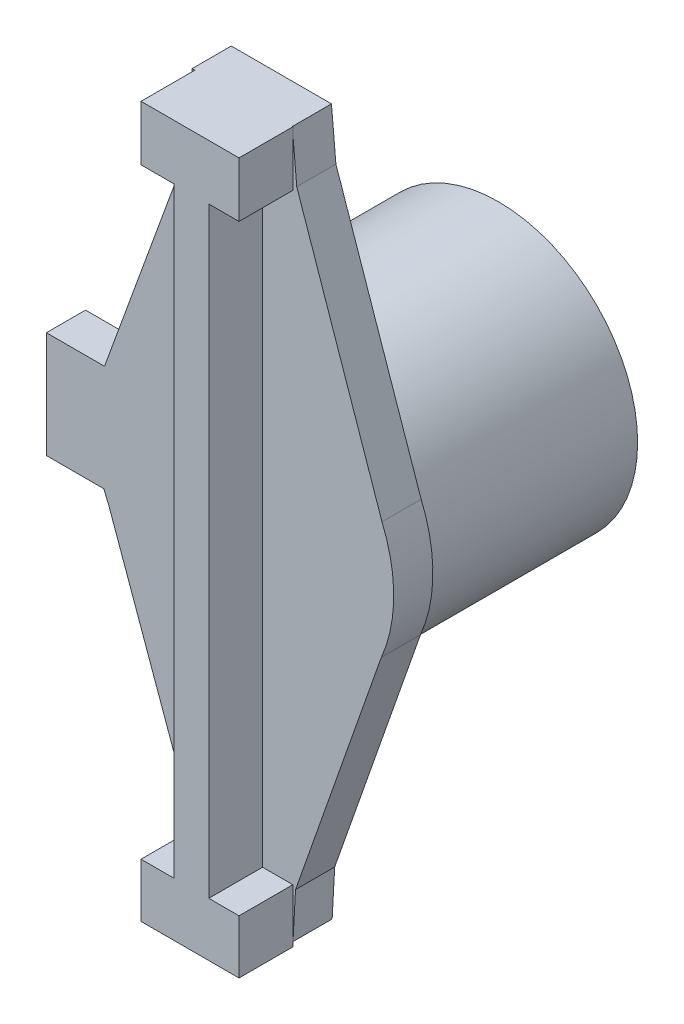
ISO-10303-21;
HEADER;
FILE_DESCRIPTION(('STEP AP214'),'2;1');
FILE_NAME('part.step','',(''),(''),'','','');
FILE_SCHEMA(('AUTOMOTIVE_DESIGN { 1 0 10303 214 1 1 1 1 }'));
ENDSEC;
DATA;
#1=APPLICATION_CONTEXT('core data for automotive mechanical design processes');
#2=APPLICATION_PROTOCOL_DEFINITION('international standard','automotive_design',2000,#1);
#3=PRODUCT_CONTEXT('',#1,'mechanical');
#4=PRODUCT('Part','Part','',(#3));
#5=PRODUCT_RELATED_PRODUCT_CATEGORY('part','',(#4));
#6=PRODUCT_DEFINITION_FORMATION('','',#4);
#7=PRODUCT_DEFINITION_CONTEXT('part definition',#1,'design');
#8=PRODUCT_DEFINITION('design','',#6,#7);
#9=PRODUCT_DEFINITION_SHAPE('','',#8);
#10=(LENGTH_UNIT() NAMED_UNIT(*) SI_UNIT(.MILLI.,.METRE.));
#11=(NAMED_UNIT(*) PLANE_ANGLE_UNIT() SI_UNIT($,.RADIAN.));
#12=(NAMED_UNIT(*) SI_UNIT($,.STERADIAN.) SOLID_ANGLE_UNIT());
#13=UNCERTAINTY_MEASURE_WITH_UNIT(LENGTH_MEASURE(1.E-05),#10,'distance_accuracy_value','');
#14=(GEOMETRIC_REPRESENTATION_CONTEXT(3) GLOBAL_UNCERTAINTY_ASSIGNED_CONTEXT((#13)) GLOBAL_UNIT_ASSIGNED_CONTEXT((#10,
#11,#12)) REPRESENTATION_CONTEXT('',''));
#15=CARTESIAN_POINT('',(0.,0.,0.));
#16=DIRECTION('',(0.,0.,1.));
#17=DIRECTION('',(1.,0.,0.));
#18=AXIS2_PLACEMENT_3D('',#15,#16,#17);
#19=CARTESIAN_POINT('',(0.,0.,0.052));
#20=DIRECTION('',(0.,0.,1.));
#21=DIRECTION('',(1.,0.,0.));
#22=AXIS2_PLACEMENT_3D('',#19,#20,#21);
#23=PLANE('',#22);
#24=DIRECTION('',(-1.,0.,0.));
#25=VECTOR('',#24,1.);
#26=CARTESIAN_POINT('',(-0.0100488610567288,-0.0614435844659321,0.052));
#27=LINE('',#26,#25);
#28=CARTESIAN_POINT('',(-0.00327120184824655,-0.0614435844659321,0.052));
#29=VERTEX_POINT('',#28);
#30=CARTESIAN_POINT('',(-0.0100488610567288,-0.0614435844659321,0.052));
#31=VERTEX_POINT('',#30);
#32=EDGE_CURVE('E272',#29,#31,#27,.T.);
#33=ORIENTED_EDGE('',*,*,#32,.F.);
#34=DIRECTION('',(0.,-1.,0.));
#35=VECTOR('',#34,1.);
#36=CARTESIAN_POINT('',(-0.00327120184824655,-0.0614435844659321,0.052));
#37=LINE('',#36,#35);
#38=CARTESIAN_POINT('',(-0.00327120184824655,0.0614105010447875,0.052));
#39=VERTEX_POINT('',#38);
#40=EDGE_CURVE('E247',#39,#29,#37,.T.);
#41=ORIENTED_EDGE('',*,*,#40,.F.);
#42=DIRECTION('',(1.,0.,0.));
#43=VECTOR('',#42,1.);
#44=CARTESIAN_POINT('',(-0.0100488610567288,0.0614105010447875,0.052));
#45=LINE('',#44,#43);
#46=CARTESIAN_POINT('',(-0.0100488610567288,0.0614105010447875,0.052));
#47=VERTEX_POINT('',#46);
#48=EDGE_CURVE('E65',#47,#39,#45,.T.);
#49=ORIENTED_EDGE('',*,*,#48,.F.);
#50=DIRECTION('',(0.,-1.,0.));
#51=VECTOR('',#50,1.);
#52=CARTESIAN_POINT('',(-0.0100488610567288,0.0726560830045513,0.052));
#53=LINE('',#52,#51);
#54=CARTESIAN_POINT('',(-0.0100488610567288,0.0726560830045513,0.052));
#55=VERTEX_POINT('',#54);
#56=EDGE_CURVE('E536',#55,#47,#53,.T.);
#57=ORIENTED_EDGE('',*,*,#56,.F.);
#58=DIRECTION('',(-1.,0.,0.));
#59=VECTOR('',#58,1.);
#60=CARTESIAN_POINT('',(-0.0106172179803252,0.0726560830045513,0.052));
#61=LINE('',#60,#59);
#62=CARTESIAN_POINT('',(-0.0106172179803252,0.0726560830045513,0.052));
#63=VERTEX_POINT('',#62);
#64=EDGE_CURVE('E273',#55,#63,#61,.T.);
#65=ORIENTED_EDGE('',*,*,#64,.T.);
#66=DIRECTION('',(0.,-1.,0.));
#67=VECTOR('',#66,1.);
#68=CARTESIAN_POINT('',(-0.0106172179803252,0.0601865723729134,0.052));
#69=LINE('',#68,#67);
#70=CARTESIAN_POINT('',(-0.0106172179803252,0.0601865723729134,0.052));
#71=VERTEX_POINT('',#70);
#72=EDGE_CURVE('E275',#63,#71,#69,.T.);
#73=ORIENTED_EDGE('',*,*,#72,.T.);
#74=DIRECTION('',(-0.342138082617705,-0.939649686012123,0.));
#75=VECTOR('',#74,1.);
#76=CARTESIAN_POINT('',(-0.0285118584912178,0.0110406450656972,0.052));
#77=LINE('',#76,#75);
#78=CARTESIAN_POINT('',(-0.0285118584912178,0.0110406450656972,0.052));
#79=VERTEX_POINT('',#78);
#80=EDGE_CURVE('E278',#71,#79,#77,.T.);
#81=ORIENTED_EDGE('',*,*,#80,.T.);
#82=DIRECTION('',(-1.,0.,0.));
#83=VECTOR('',#82,1.);
#84=CARTESIAN_POINT('',(-0.0285118584912178,0.0110406450656972,0.052));
#85=LINE('',#84,#83);
#86=CARTESIAN_POINT('',(-0.0403866580337496,0.0110406450656972,0.052));
#87=VERTEX_POINT('',#86);
#88=EDGE_CURVE('E280',#79,#87,#85,.T.);
#89=ORIENTED_EDGE('',*,*,#88,.T.);
#90=DIRECTION('',(0.,-1.,0.));
#91=VECTOR('',#90,1.);
#92=CARTESIAN_POINT('',(-0.0403866580337496,0.0110406450656972,0.052));
#93=LINE('',#92,#91);
#94=CARTESIAN_POINT('',(-0.0403866580337496,-0.0106909975956442,0.052));
#95=VERTEX_POINT('',#94);
#96=EDGE_CURVE('E282',#87,#95,#93,.T.);
#97=ORIENTED_EDGE('',*,*,#96,.T.);
#98=DIRECTION('',(1.,0.,0.));
#99=VECTOR('',#98,1.);
#100=CARTESIAN_POINT('',(-0.0286447986290681,-0.0106909975956442,0.052));
#101=LINE('',#100,#99);
#102=CARTESIAN_POINT('',(-0.0286447986290681,-0.0106909975956442,0.052));
#103=VERTEX_POINT('',#102);
#104=EDGE_CURVE('E284',#95,#103,#101,.T.);
#105=ORIENTED_EDGE('',*,*,#104,.T.);
#106=CARTESIAN_POINT('',(0.,0.,0.052));
#107=DIRECTION('',(0.,0.,1.));
#108=DIRECTION('',(1.,0.,0.));
#109=AXIS2_PLACEMENT_3D('',#106,#107,#108);
#110=CIRCLE('',#109,0.0305748576135676);
#111=CARTESIAN_POINT('',(-0.0277124755475539,-0.0129166798023393,0.052));
#112=VERTEX_POINT('',#111);
#113=EDGE_CURVE('E286',#103,#112,#110,.T.);
#114=ORIENTED_EDGE('',*,*,#113,.T.);
#115=DIRECTION('',(0.338022111685065,-0.941138168396102,0.));
#116=VECTOR('',#115,1.);
#117=CARTESIAN_POINT('',(-0.0277124755475539,-0.0129166798023393,0.052));
#118=LINE('',#117,#116);
#119=CARTESIAN_POINT('',(-0.0112383142113686,-0.058784868568182,0.052));
#120=VERTEX_POINT('',#119);
#121=EDGE_CURVE('E288',#112,#120,#118,.T.);
#122=ORIENTED_EDGE('',*,*,#121,.T.);
#123=DIRECTION('',(0.0969304244465507,-0.995291159820387,0.));
#124=VECTOR('',#123,1.);
#125=CARTESIAN_POINT('',(-0.0112383142113686,-0.058784868568182,0.052));
#126=LINE('',#125,#124);
#127=CARTESIAN_POINT('',(-0.0100488610567288,-0.0709982908924209,0.052));
#128=VERTEX_POINT('',#127);
#129=EDGE_CURVE('E291',#120,#128,#126,.T.);
#130=ORIENTED_EDGE('',*,*,#129,.T.);
#131=DIRECTION('',(0.,-1.,0.));
#132=VECTOR('',#131,1.);
#133=CARTESIAN_POINT('',(-0.0100488610567288,-0.0724526365547243,0.052));
#134=LINE('',#133,#132);
#135=EDGE_CURVE('E265',#31,#128,#134,.T.);
#136=ORIENTED_EDGE('',*,*,#135,.F.);
#137=EDGE_LOOP('',(#33,#41,#49,#57,#65,#73,#81,#89,#97,#105,#114,#122,#130,#136));
#138=FACE_BOUND('',#137,.T.);
#139=ADVANCED_FACE('F39',(#138),#23,.T.);
#140=CARTESIAN_POINT('',(0.00378832617781402,0.0614105010447875,0.052));
#141=VERTEX_POINT('',#140);
#142=CARTESIAN_POINT('',(0.0099699094616387,0.0614105010447875,0.052));
#143=VERTEX_POINT('',#142);
#144=EDGE_CURVE('E538',#141,#143,#45,.T.);
#145=ORIENTED_EDGE('',*,*,#144,.F.);
#146=DIRECTION('',(0.,1.,0.));
#147=VECTOR('',#146,1.);
#148=CARTESIAN_POINT('',(0.00378832617781402,-0.0614435844659321,0.052));
#149=LINE('',#148,#147);
#150=CARTESIAN_POINT('',(0.00378832617781402,-0.0614435844659321,0.052));
#151=VERTEX_POINT('',#150);
#152=EDGE_CURVE('E242',#151,#141,#149,.T.);
#153=ORIENTED_EDGE('',*,*,#152,.F.);
#154=CARTESIAN_POINT('',(0.0099699094616387,-0.0614435844659321,0.052));
#155=VERTEX_POINT('',#154);
#156=EDGE_CURVE('E569',#155,#151,#27,.T.);
#157=ORIENTED_EDGE('',*,*,#156,.F.);
#158=DIRECTION('',(0.,1.,0.));
#159=VECTOR('',#158,1.);
#160=CARTESIAN_POINT('',(0.0099699094616387,-0.0724526365547243,0.052));
#161=LINE('',#160,#159);
#162=CARTESIAN_POINT('',(0.00996990946163869,-0.0715000033378601,0.052));
#163=VERTEX_POINT('',#162);
#164=EDGE_CURVE('E11',#163,#155,#161,.T.);
#165=ORIENTED_EDGE('',*,*,#164,.F.);
#166=DIRECTION('',(1.,0.,0.));
#167=VECTOR('',#166,1.);
#168=CARTESIAN_POINT('',(-0.00999999977648258,-0.0715000033378601,0.052));
#169=LINE('',#168,#167);
#170=CARTESIAN_POINT('',(0.00999999977648258,-0.0715000033378601,0.052));
#171=VERTEX_POINT('',#170);
#172=EDGE_CURVE('E294',#163,#171,#169,.T.);
#173=ORIENTED_EDGE('',*,*,#172,.T.);
#174=DIRECTION('',(0.0542777020089095,0.998525879015978,0.));
#175=VECTOR('',#174,1.);
#176=CARTESIAN_POINT('',(0.00999999977648258,-0.0715000033378601,0.052));
#177=LINE('',#176,#175);
#178=CARTESIAN_POINT('',(0.0105143049731851,-0.062038529664278,0.052));
#179=VERTEX_POINT('',#178);
#180=EDGE_CURVE('E298',#171,#179,#177,.T.);
#181=ORIENTED_EDGE('',*,*,#180,.T.);
#182=DIRECTION('',(0.331619327842881,0.943413282395916,0.));
#183=VECTOR('',#182,1.);
#184=CARTESIAN_POINT('',(0.0105143049731851,-0.062038529664278,0.052));
#185=LINE('',#184,#183);
#186=CARTESIAN_POINT('',(0.0280233892041364,-0.0122274926131003,0.052));
#187=VERTEX_POINT('',#186);
#188=EDGE_CURVE('E300',#179,#187,#185,.T.);
#189=ORIENTED_EDGE('',*,*,#188,.T.);
#190=CARTESIAN_POINT('',(0.,0.,0.052));
#191=DIRECTION('',(0.,0.,1.));
#192=DIRECTION('',(1.,0.,0.));
#193=AXIS2_PLACEMENT_3D('',#190,#191,#192);
#194=CIRCLE('',#193,0.0305748576135676);
#195=CARTESIAN_POINT('',(0.0281779608880969,0.0118669473024369,0.052));
#196=VERTEX_POINT('',#195);
#197=EDGE_CURVE('E302',#187,#196,#194,.T.);
#198=ORIENTED_EDGE('',*,*,#197,.T.);
#199=DIRECTION('',(-0.325560403300371,0.945521244501095,0.));
#200=VECTOR('',#199,1.);
#201=CARTESIAN_POINT('',(0.0107651203870773,0.0624388548621924,0.052));
#202=LINE('',#201,#200);
#203=CARTESIAN_POINT('',(0.0107651203870773,0.0624388548621924,0.052));
#204=VERTEX_POINT('',#203);
#205=EDGE_CURVE('E304',#196,#204,#202,.T.);
#206=ORIENTED_EDGE('',*,*,#205,.T.);
#207=DIRECTION('',(-0.0886751888707778,0.996060595987379,0.));
#208=VECTOR('',#207,1.);
#209=CARTESIAN_POINT('',(0.0098555224781656,0.0726560830045513,0.052));
#210=LINE('',#209,#208);
#211=CARTESIAN_POINT('',(0.0099699094616387,0.0713712098807122,0.052));
#212=VERTEX_POINT('',#211);
#213=EDGE_CURVE('E307',#204,#212,#210,.T.);
#214=ORIENTED_EDGE('',*,*,#213,.T.);
#215=DIRECTION('',(0.,1.,0.));
#216=VECTOR('',#215,1.);
#217=CARTESIAN_POINT('',(0.0099699094616387,0.0726560830045513,0.052));
#218=LINE('',#217,#216);
#219=EDGE_CURVE('E548',#143,#212,#218,.T.);
#220=ORIENTED_EDGE('',*,*,#219,.F.);
#221=EDGE_LOOP('',(#145,#153,#157,#165,#173,#181,#189,#198,#206,#214,#220));
#222=FACE_BOUND('',#221,.T.);
#223=ADVANCED_FACE('F406',(#222),#23,.T.);
#224=CARTESIAN_POINT('',(-0.0100488610567288,-0.0614435844659321,0.063));
#225=DIRECTION('',(0.,-1.,0.));
#226=DIRECTION('',(0.,0.,-1.));
#227=AXIS2_PLACEMENT_3D('',#224,#225,#226);
#228=PLANE('',#227);
#229=DIRECTION('',(0.,0.,-1.));
#230=VECTOR('',#229,1.);
#231=CARTESIAN_POINT('',(-0.00327120184824655,-0.0614435844659321,0.063));
#232=LINE('',#231,#230);
#233=CARTESIAN_POINT('',(-0.00327120184824655,-0.0614435844659321,0.063));
#234=VERTEX_POINT('',#233);
#235=EDGE_CURVE('E245',#234,#29,#232,.T.);
#236=ORIENTED_EDGE('',*,*,#235,.T.);
#237=ORIENTED_EDGE('',*,*,#32,.T.);
#238=DIRECTION('',(0.,0.,-1.));
#239=VECTOR('',#238,1.);
#240=CARTESIAN_POINT('',(-0.0100488610567288,-0.0614435844659321,0.063));
#241=LINE('',#240,#239);
#242=CARTESIAN_POINT('',(-0.0100488610567288,-0.0614435844659321,0.063));
#243=VERTEX_POINT('',#242);
#244=EDGE_CURVE('E255',#243,#31,#241,.T.);
#245=ORIENTED_EDGE('',*,*,#244,.F.);
#246=DIRECTION('',(-1.,0.,0.));
#247=VECTOR('',#246,1.);
#248=CARTESIAN_POINT('',(-0.0100488610567288,-0.0614435844659321,0.063));
#249=LINE('',#248,#247);
#250=EDGE_CURVE('E236',#234,#243,#249,.T.);
#251=ORIENTED_EDGE('',*,*,#250,.F.);
#252=EDGE_LOOP('',(#236,#237,#245,#251));
#253=FACE_BOUND('',#252,.T.);
#254=ADVANCED_FACE('F253',(#253),#228,.F.);
#255=DIRECTION('',(0.,0.,-1.));
#256=VECTOR('',#255,1.);
#257=CARTESIAN_POINT('',(0.00378832617781402,-0.0614435844659321,0.063));
#258=LINE('',#257,#256);
#259=CARTESIAN_POINT('',(0.00378832617781402,-0.0614435844659321,0.063));
#260=VERTEX_POINT('',#259);
#261=EDGE_CURVE('E251',#260,#151,#258,.T.);
#262=ORIENTED_EDGE('',*,*,#261,.F.);
#263=CARTESIAN_POINT('',(0.0099699094616387,-0.0614435844659321,0.063));
#264=VERTEX_POINT('',#263);
#265=EDGE_CURVE('E257',#264,#260,#249,.T.);
#266=ORIENTED_EDGE('',*,*,#265,.F.);
#267=DIRECTION('',(0.,0.,-1.));
#268=VECTOR('',#267,1.);
#269=CARTESIAN_POINT('',(0.0099699094616387,-0.0614435844659321,0.063));
#270=LINE('',#269,#268);
#271=EDGE_CURVE('E261',#264,#155,#270,.T.);
#272=ORIENTED_EDGE('',*,*,#271,.T.);
#273=ORIENTED_EDGE('',*,*,#156,.T.);
#274=EDGE_LOOP('',(#262,#266,#272,#273));
#275=FACE_BOUND('',#274,.T.);
#276=ADVANCED_FACE('F583',(#275),#228,.F.);
#277=CARTESIAN_POINT('',(-0.0100488610567288,0.0614105010447875,0.063));
#278=DIRECTION('',(0.,1.,0.));
#279=DIRECTION('',(0.,0.,1.));
#280=AXIS2_PLACEMENT_3D('',#277,#278,#279);
#281=PLANE('',#280);
#282=DIRECTION('',(0.,0.,-1.));
#283=VECTOR('',#282,1.);
#284=CARTESIAN_POINT('',(-0.00327120184824655,0.0614105010447875,0.063));
#285=LINE('',#284,#283);
#286=CARTESIAN_POINT('',(-0.00327120184824655,0.0614105010447875,0.063));
#287=VERTEX_POINT('',#286);
#288=EDGE_CURVE('E586',#287,#39,#285,.T.);
#289=ORIENTED_EDGE('',*,*,#288,.F.);
#290=DIRECTION('',(1.,0.,0.));
#291=VECTOR('',#290,1.);
#292=CARTESIAN_POINT('',(-0.0100488610567288,0.0614105010447875,0.063));
#293=LINE('',#292,#291);
#294=CARTESIAN_POINT('',(-0.0100488610567288,0.0614105010447875,0.063));
#295=VERTEX_POINT('',#294);
#296=EDGE_CURVE('E238',#295,#287,#293,.T.);
#297=ORIENTED_EDGE('',*,*,#296,.F.);
#298=DIRECTION('',(0.,0.,-1.));
#299=VECTOR('',#298,1.);
#300=CARTESIAN_POINT('',(-0.0100488610567288,0.0614105010447875,0.063));
#301=LINE('',#300,#299);
#302=EDGE_CURVE('E315',#295,#47,#301,.T.);
#303=ORIENTED_EDGE('',*,*,#302,.T.);
#304=ORIENTED_EDGE('',*,*,#48,.T.);
#305=EDGE_LOOP('',(#289,#297,#303,#304));
#306=FACE_BOUND('',#305,.T.);
#307=ADVANCED_FACE('F599',(#306),#281,.F.);
#308=DIRECTION('',(0.,0.,-1.));
#309=VECTOR('',#308,1.);
#310=CARTESIAN_POINT('',(0.00378832617781402,0.0614105010447875,0.063));
#311=LINE('',#310,#309);
#312=CARTESIAN_POINT('',(0.00378832617781402,0.0614105010447875,0.063));
#313=VERTEX_POINT('',#312);
#314=EDGE_CURVE('E57',#313,#141,#311,.T.);
#315=ORIENTED_EDGE('',*,*,#314,.T.);
#316=ORIENTED_EDGE('',*,*,#144,.T.);
#317=DIRECTION('',(0.,0.,-1.));
#318=VECTOR('',#317,1.);
#319=CARTESIAN_POINT('',(0.0099699094616387,0.0614105010447875,0.063));
#320=LINE('',#319,#318);
#321=CARTESIAN_POINT('',(0.0099699094616387,0.0614105010447875,0.063));
#322=VERTEX_POINT('',#321);
#323=EDGE_CURVE('E559',#322,#143,#320,.T.);
#324=ORIENTED_EDGE('',*,*,#323,.F.);
#325=EDGE_CURVE('E591',#313,#322,#293,.T.);
#326=ORIENTED_EDGE('',*,*,#325,.F.);
#327=EDGE_LOOP('',(#315,#316,#324,#326));
#328=FACE_BOUND('',#327,.T.);
#329=ADVANCED_FACE('F403',(#328),#281,.F.);
#330=CARTESIAN_POINT('',(0.,0.,0.044));
#331=DIRECTION('',(0.,0.,-1.));
#332=DIRECTION('',(-1.,0.,0.));
#333=AXIS2_PLACEMENT_3D('',#330,#331,#332);
#334=CYLINDRICAL_SURFACE('',#333,0.0284066817730633);
#335=CARTESIAN_POINT('',(0.,0.,0.044));
#336=DIRECTION('',(0.,0.,1.));
#337=DIRECTION('',(1.,0.,0.));
#338=AXIS2_PLACEMENT_3D('',#335,#336,#337);
#339=CIRCLE('',#338,0.0284066817730633);
#340=CARTESIAN_POINT('',(0.0284066817730633,0.,0.044));
#341=VERTEX_POINT('',#340);
#342=EDGE_CURVE('E48',#341,#341,#339,.T.);
#343=ORIENTED_EDGE('',*,*,#342,.F.);
#344=EDGE_LOOP('',(#343));
#345=FACE_BOUND('',#344,.T.);
#346=CARTESIAN_POINT('',(0.,0.,0.));
#347=DIRECTION('',(0.,0.,1.));
#348=DIRECTION('',(1.,0.,0.));
#349=AXIS2_PLACEMENT_3D('',#346,#347,#348);
#350=CIRCLE('',#349,0.0284066817730633);
#351=CARTESIAN_POINT('',(0.0284066817730633,0.,0.));
#352=VERTEX_POINT('',#351);
#353=EDGE_CURVE('E43',#352,#352,#350,.T.);
#354=ORIENTED_EDGE('',*,*,#353,.T.);
#355=EDGE_LOOP('',(#354));
#356=FACE_BOUND('',#355,.T.);
#357=ADVANCED_FACE('F41',(#345,#356),#334,.T.);
#358=CARTESIAN_POINT('',(0.,0.,0.));
#359=DIRECTION('',(0.,0.,1.));
#360=DIRECTION('',(1.,0.,0.));
#361=AXIS2_PLACEMENT_3D('',#358,#359,#360);
#362=PLANE('',#361);
#363=ORIENTED_EDGE('',*,*,#353,.F.);
#364=EDGE_LOOP('',(#363));
#365=FACE_BOUND('',#364,.T.);
#366=ADVANCED_FACE('F392',(#365),#362,.F.);
#367=CARTESIAN_POINT('',(-0.0106172179803252,0.0726560830045513,0.052));
#368=DIRECTION('',(0.,-1.,0.));
#369=DIRECTION('',(0.,0.,-1.));
#370=AXIS2_PLACEMENT_3D('',#367,#368,#369);
#371=PLANE('',#370);
#372=DIRECTION('',(-1.,0.,0.));
#373=VECTOR('',#372,1.);
#374=CARTESIAN_POINT('',(-0.0106172179803252,0.0726560830045513,0.044));
#375=LINE('',#374,#373);
#376=CARTESIAN_POINT('',(0.0098555224781656,0.0726560830045513,0.044));
#377=VERTEX_POINT('',#376);
#378=CARTESIAN_POINT('',(-0.0106172179803252,0.0726560830045513,0.044));
#379=VERTEX_POINT('',#378);
#380=EDGE_CURVE('E311',#377,#379,#375,.T.);
#381=ORIENTED_EDGE('',*,*,#380,.T.);
#382=DIRECTION('',(0.,0.,-1.));
#383=VECTOR('',#382,1.);
#384=CARTESIAN_POINT('',(-0.0106172179803252,0.0726560830045513,0.052));
#385=LINE('',#384,#383);
#386=EDGE_CURVE('E383',#63,#379,#385,.T.);
#387=ORIENTED_EDGE('',*,*,#386,.F.);
#388=ORIENTED_EDGE('',*,*,#64,.F.);
#389=DIRECTION('',(0.,0.,-1.));
#390=VECTOR('',#389,1.);
#391=CARTESIAN_POINT('',(-0.0100488610567288,0.0726560830045513,0.063));
#392=LINE('',#391,#390);
#393=CARTESIAN_POINT('',(-0.0100488610567288,0.0726560830045513,0.063));
#394=VERTEX_POINT('',#393);
#395=EDGE_CURVE('E554',#394,#55,#392,.T.);
#396=ORIENTED_EDGE('',*,*,#395,.F.);
#397=DIRECTION('',(-1.,0.,0.));
#398=VECTOR('',#397,1.);
#399=CARTESIAN_POINT('',(-0.0100488610567288,0.0726560830045513,0.063));
#400=LINE('',#399,#398);
#401=CARTESIAN_POINT('',(0.0099699094616387,0.0726560830045513,0.063));
#402=VERTEX_POINT('',#401);
#403=EDGE_CURVE('E544',#402,#394,#400,.T.);
#404=ORIENTED_EDGE('',*,*,#403,.F.);
#405=DIRECTION('',(0.,0.,-1.));
#406=VECTOR('',#405,1.);
#407=CARTESIAN_POINT('',(0.0099699094616387,0.0726560830045513,0.063));
#408=LINE('',#407,#406);
#409=CARTESIAN_POINT('',(0.0099699094616387,0.0726560830045513,0.052));
#410=VERTEX_POINT('',#409);
#411=EDGE_CURVE('E556',#402,#410,#408,.T.);
#412=ORIENTED_EDGE('',*,*,#411,.T.);
#413=DIRECTION('',(-1.,0.,0.));
#414=VECTOR('',#413,1.);
#415=CARTESIAN_POINT('',(-0.0100488610567288,0.0726560830045513,0.052));
#416=LINE('',#415,#414);
#417=CARTESIAN_POINT('',(0.0098555224781656,0.0726560830045513,0.052));
#418=VERTEX_POINT('',#417);
#419=EDGE_CURVE('E551',#410,#418,#416,.T.);
#420=ORIENTED_EDGE('',*,*,#419,.T.);
#421=DIRECTION('',(0.,0.,-1.));
#422=VECTOR('',#421,1.);
#423=CARTESIAN_POINT('',(0.0098555224781656,0.0726560830045513,0.052));
#424=LINE('',#423,#422);
#425=EDGE_CURVE('E310',#418,#377,#424,.T.);
#426=ORIENTED_EDGE('',*,*,#425,.T.);
#427=EDGE_LOOP('',(#381,#387,#388,#396,#404,#412,#420,#426));
#428=FACE_BOUND('',#427,.T.);
#429=ADVANCED_FACE('F394',(#428),#371,.F.);
#430=CARTESIAN_POINT('',(-0.0106172179803252,0.0601865723729134,0.052));
#431=DIRECTION('',(1.,0.,0.));
#432=DIRECTION('',(0.,0.,-1.));
#433=AXIS2_PLACEMENT_3D('',#430,#431,#432);
#434=PLANE('',#433);
#435=DIRECTION('',(0.,-1.,0.));
#436=VECTOR('',#435,1.);
#437=CARTESIAN_POINT('',(-0.0106172179803252,0.0601865723729134,0.044));
#438=LINE('',#437,#436);
#439=CARTESIAN_POINT('',(-0.0106172179803252,0.0601865723729134,0.044));
#440=VERTEX_POINT('',#439);
#441=EDGE_CURVE('E314',#379,#440,#438,.T.);
#442=ORIENTED_EDGE('',*,*,#441,.T.);
#443=DIRECTION('',(0.,0.,-1.));
#444=VECTOR('',#443,1.);
#445=CARTESIAN_POINT('',(-0.0106172179803252,0.0601865723729134,0.052));
#446=LINE('',#445,#444);
#447=EDGE_CURVE('E380',#71,#440,#446,.T.);
#448=ORIENTED_EDGE('',*,*,#447,.F.);
#449=ORIENTED_EDGE('',*,*,#72,.F.);
#450=ORIENTED_EDGE('',*,*,#386,.T.);
#451=EDGE_LOOP('',(#442,#448,#449,#450));
#452=FACE_BOUND('',#451,.T.);
#453=ADVANCED_FACE('F400',(#452),#434,.F.);
#454=CARTESIAN_POINT('',(-0.0285118584912178,0.0110406450656972,0.052));
#455=DIRECTION('',(0.939649686012123,-0.342138082617705,0.));
#456=DIRECTION('',(0.342138082617705,0.939649686012123,0.));
#457=AXIS2_PLACEMENT_3D('',#454,#455,#456);
#458=PLANE('',#457);
#459=DIRECTION('',(-0.342138082617705,-0.939649686012123,0.));
#460=VECTOR('',#459,1.);
#461=CARTESIAN_POINT('',(-0.0285118584912178,0.0110406450656972,0.044));
#462=LINE('',#461,#460);
#463=CARTESIAN_POINT('',(-0.0285118584912178,0.0110406450656972,0.044));
#464=VERTEX_POINT('',#463);
#465=EDGE_CURVE('E317',#440,#464,#462,.T.);
#466=ORIENTED_EDGE('',*,*,#465,.T.);
#467=DIRECTION('',(0.,0.,-1.));
#468=VECTOR('',#467,1.);
#469=CARTESIAN_POINT('',(-0.0285118584912178,0.0110406450656972,0.052));
#470=LINE('',#469,#468);
#471=EDGE_CURVE('E377',#79,#464,#470,.T.);
#472=ORIENTED_EDGE('',*,*,#471,.F.);
#473=ORIENTED_EDGE('',*,*,#80,.F.);
#474=ORIENTED_EDGE('',*,*,#447,.T.);
#475=EDGE_LOOP('',(#466,#472,#473,#474));
#476=FACE_BOUND('',#475,.T.);
#477=ADVANCED_FACE('F468',(#476),#458,.F.);
#478=CARTESIAN_POINT('',(-0.0285118584912178,0.0110406450656972,0.052));
#479=DIRECTION('',(0.,-1.,0.));
#480=DIRECTION('',(0.,0.,-1.));
#481=AXIS2_PLACEMENT_3D('',#478,#479,#480);
#482=PLANE('',#481);
#483=DIRECTION('',(-1.,0.,0.));
#484=VECTOR('',#483,1.);
#485=CARTESIAN_POINT('',(-0.0285118584912178,0.0110406450656972,0.044));
#486=LINE('',#485,#484);
#487=CARTESIAN_POINT('',(-0.0403866580337496,0.0110406450656972,0.044));
#488=VERTEX_POINT('',#487);
#489=EDGE_CURVE('E319',#464,#488,#486,.T.);
#490=ORIENTED_EDGE('',*,*,#489,.T.);
#491=DIRECTION('',(0.,0.,-1.));
#492=VECTOR('',#491,1.);
#493=CARTESIAN_POINT('',(-0.0403866580337496,0.0110406450656972,0.052));
#494=LINE('',#493,#492);
#495=EDGE_CURVE('E374',#87,#488,#494,.T.);
#496=ORIENTED_EDGE('',*,*,#495,.F.);
#497=ORIENTED_EDGE('',*,*,#88,.F.);
#498=ORIENTED_EDGE('',*,*,#471,.T.);
#499=EDGE_LOOP('',(#490,#496,#497,#498));
#500=FACE_BOUND('',#499,.T.);
#501=ADVANCED_FACE('F464',(#500),#482,.F.);
#502=CARTESIAN_POINT('',(-0.0403866580337496,0.0110406450656972,0.052));
#503=DIRECTION('',(1.,0.,0.));
#504=DIRECTION('',(0.,0.,-1.));
#505=AXIS2_PLACEMENT_3D('',#502,#503,#504);
#506=PLANE('',#505);
#507=DIRECTION('',(0.,-1.,0.));
#508=VECTOR('',#507,1.);
#509=CARTESIAN_POINT('',(-0.0403866580337496,0.0110406450656972,0.044));
#510=LINE('',#509,#508);
#511=CARTESIAN_POINT('',(-0.0403866580337496,-0.0106909975956442,0.044));
#512=VERTEX_POINT('',#511);
#513=EDGE_CURVE('E321',#488,#512,#510,.T.);
#514=ORIENTED_EDGE('',*,*,#513,.T.);
#515=DIRECTION('',(0.,0.,-1.));
#516=VECTOR('',#515,1.);
#517=CARTESIAN_POINT('',(-0.0403866580337496,-0.0106909975956442,0.052));
#518=LINE('',#517,#516);
#519=EDGE_CURVE('E371',#95,#512,#518,.T.);
#520=ORIENTED_EDGE('',*,*,#519,.F.);
#521=ORIENTED_EDGE('',*,*,#96,.F.);
#522=ORIENTED_EDGE('',*,*,#495,.T.);
#523=EDGE_LOOP('',(#514,#520,#521,#522));
#524=FACE_BOUND('',#523,.T.);
#525=ADVANCED_FACE('F460',(#524),#506,.F.);
#526=CARTESIAN_POINT('',(-0.0286447986290681,-0.0106909975956442,0.052));
#527=DIRECTION('',(0.,1.,0.));
#528=DIRECTION('',(0.,0.,1.));
#529=AXIS2_PLACEMENT_3D('',#526,#527,#528);
#530=PLANE('',#529);
#531=DIRECTION('',(1.,0.,0.));
#532=VECTOR('',#531,1.);
#533=CARTESIAN_POINT('',(-0.0286447986290681,-0.0106909975956442,0.044));
#534=LINE('',#533,#532);
#535=CARTESIAN_POINT('',(-0.0286447986290681,-0.0106909975956442,0.044));
#536=VERTEX_POINT('',#535);
#537=EDGE_CURVE('E323',#512,#536,#534,.T.);
#538=ORIENTED_EDGE('',*,*,#537,.T.);
#539=DIRECTION('',(0.,0.,-1.));
#540=VECTOR('',#539,1.);
#541=CARTESIAN_POINT('',(-0.0286447986290681,-0.0106909975956442,0.052));
#542=LINE('',#541,#540);
#543=EDGE_CURVE('E368',#103,#536,#542,.T.);
#544=ORIENTED_EDGE('',*,*,#543,.F.);
#545=ORIENTED_EDGE('',*,*,#104,.F.);
#546=ORIENTED_EDGE('',*,*,#519,.T.);
#547=EDGE_LOOP('',(#538,#544,#545,#546));
#548=FACE_BOUND('',#547,.T.);
#549=ADVANCED_FACE('F456',(#548),#530,.F.);
#550=CARTESIAN_POINT('',(0.,0.,0.052));
#551=DIRECTION('',(0.,0.,-1.));
#552=DIRECTION('',(-1.,0.,0.));
#553=AXIS2_PLACEMENT_3D('',#550,#551,#552);
#554=CYLINDRICAL_SURFACE('',#553,0.0305748576135676);
#555=CARTESIAN_POINT('',(0.,0.,0.044));
#556=DIRECTION('',(0.,0.,1.));
#557=DIRECTION('',(1.,0.,0.));
#558=AXIS2_PLACEMENT_3D('',#555,#556,#557);
#559=CIRCLE('',#558,0.0305748576135676);
#560=CARTESIAN_POINT('',(-0.0277124755475539,-0.0129166798023393,0.044));
#561=VERTEX_POINT('',#560);
#562=EDGE_CURVE('E325',#536,#561,#559,.T.);
#563=ORIENTED_EDGE('',*,*,#562,.T.);
#564=DIRECTION('',(0.,0.,-1.));
#565=VECTOR('',#564,1.);
#566=CARTESIAN_POINT('',(-0.0277124755475539,-0.0129166798023393,0.052));
#567=LINE('',#566,#565);
#568=EDGE_CURVE('E365',#112,#561,#567,.T.);
#569=ORIENTED_EDGE('',*,*,#568,.F.);
#570=ORIENTED_EDGE('',*,*,#113,.F.);
#571=ORIENTED_EDGE('',*,*,#543,.T.);
#572=EDGE_LOOP('',(#563,#569,#570,#571));
#573=FACE_BOUND('',#572,.T.);
#574=ADVANCED_FACE('F452',(#573),#554,.T.);
#575=CARTESIAN_POINT('',(-0.0277124755475539,-0.0129166798023393,0.052));
#576=DIRECTION('',(0.941138168396102,0.338022111685065,0.));
#577=DIRECTION('',(-0.338022111685065,0.941138168396102,0.));
#578=AXIS2_PLACEMENT_3D('',#575,#576,#577);
#579=PLANE('',#578);
#580=DIRECTION('',(0.338022111685065,-0.941138168396102,0.));
#581=VECTOR('',#580,1.);
#582=CARTESIAN_POINT('',(-0.0277124755475539,-0.0129166798023393,0.044));
#583=LINE('',#582,#581);
#584=CARTESIAN_POINT('',(-0.0112383142113686,-0.058784868568182,0.044));
#585=VERTEX_POINT('',#584);
#586=EDGE_CURVE('E327',#561,#585,#583,.T.);
#587=ORIENTED_EDGE('',*,*,#586,.T.);
#588=DIRECTION('',(0.,0.,-1.));
#589=VECTOR('',#588,1.);
#590=CARTESIAN_POINT('',(-0.0112383142113686,-0.058784868568182,0.052));
#591=LINE('',#590,#589);
#592=EDGE_CURVE('E362',#120,#585,#591,.T.);
#593=ORIENTED_EDGE('',*,*,#592,.F.);
#594=ORIENTED_EDGE('',*,*,#121,.F.);
#595=ORIENTED_EDGE('',*,*,#568,.T.);
#596=EDGE_LOOP('',(#587,#593,#594,#595));
#597=FACE_BOUND('',#596,.T.);
#598=ADVANCED_FACE('F448',(#597),#579,.F.);
#599=CARTESIAN_POINT('',(-0.0112383142113686,-0.058784868568182,0.052));
#600=DIRECTION('',(0.995291159820387,0.0969304244465507,0.));
#601=DIRECTION('',(-0.0969304244465507,0.995291159820387,0.));
#602=AXIS2_PLACEMENT_3D('',#599,#600,#601);
#603=PLANE('',#602);
#604=DIRECTION('',(0.0969304244465507,-0.995291159820387,0.));
#605=VECTOR('',#604,1.);
#606=CARTESIAN_POINT('',(-0.0112383142113686,-0.058784868568182,0.044));
#607=LINE('',#606,#605);
#608=CARTESIAN_POINT('',(-0.00999999977648258,-0.0715000033378601,0.044));
#609=VERTEX_POINT('',#608);
#610=EDGE_CURVE('E329',#585,#609,#607,.T.);
#611=ORIENTED_EDGE('',*,*,#610,.T.);
#612=DIRECTION('',(0.,0.,-1.));
#613=VECTOR('',#612,1.);
#614=CARTESIAN_POINT('',(-0.00999999977648258,-0.0715000033378601,0.052));
#615=LINE('',#614,#613);
#616=CARTESIAN_POINT('',(-0.00999999977648258,-0.0715000033378601,0.052));
#617=VERTEX_POINT('',#616);
#618=EDGE_CURVE('E359',#617,#609,#615,.T.);
#619=ORIENTED_EDGE('',*,*,#618,.F.);
#620=EDGE_CURVE('E290',#128,#617,#126,.T.);
#621=ORIENTED_EDGE('',*,*,#620,.F.);
#622=ORIENTED_EDGE('',*,*,#129,.F.);
#623=ORIENTED_EDGE('',*,*,#592,.T.);
#624=EDGE_LOOP('',(#611,#619,#621,#622,#623));
#625=FACE_BOUND('',#624,.T.);
#626=ADVANCED_FACE('F444',(#625),#603,.F.);
#627=CARTESIAN_POINT('',(-0.00999999977648258,-0.0715000033378601,0.052));
#628=DIRECTION('',(0.,1.,0.));
#629=DIRECTION('',(0.,0.,1.));
#630=AXIS2_PLACEMENT_3D('',#627,#628,#629);
#631=PLANE('',#630);
#632=DIRECTION('',(1.,0.,0.));
#633=VECTOR('',#632,1.);
#634=CARTESIAN_POINT('',(-0.00999999977648258,-0.0715000033378601,0.044));
#635=LINE('',#634,#633);
#636=CARTESIAN_POINT('',(0.00999999977648258,-0.0715000033378601,0.044));
#637=VERTEX_POINT('',#636);
#638=EDGE_CURVE('E331',#609,#637,#635,.T.);
#639=ORIENTED_EDGE('',*,*,#638,.T.);
#640=DIRECTION('',(0.,0.,-1.));
#641=VECTOR('',#640,1.);
#642=CARTESIAN_POINT('',(0.00999999977648258,-0.0715000033378601,0.052));
#643=LINE('',#642,#641);
#644=EDGE_CURVE('E356',#171,#637,#643,.T.);
#645=ORIENTED_EDGE('',*,*,#644,.F.);
#646=ORIENTED_EDGE('',*,*,#172,.F.);
#647=EDGE_CURVE('E295',#617,#163,#169,.T.);
#648=ORIENTED_EDGE('',*,*,#647,.F.);
#649=ORIENTED_EDGE('',*,*,#618,.T.);
#650=EDGE_LOOP('',(#639,#645,#646,#648,#649));
#651=FACE_BOUND('',#650,.T.);
#652=ADVANCED_FACE('F440',(#651),#631,.F.);
#653=CARTESIAN_POINT('',(0.00999999977648258,-0.0715000033378601,0.052));
#654=DIRECTION('',(-0.998525879015978,0.0542777020089095,0.));
#655=DIRECTION('',(-0.0542777020089095,-0.998525879015978,0.));
#656=AXIS2_PLACEMENT_3D('',#653,#654,#655);
#657=PLANE('',#656);
#658=DIRECTION('',(0.0542777020089095,0.998525879015978,0.));
#659=VECTOR('',#658,1.);
#660=CARTESIAN_POINT('',(0.00999999977648258,-0.0715000033378601,0.044));
#661=LINE('',#660,#659);
#662=CARTESIAN_POINT('',(0.0105143049731851,-0.062038529664278,0.044));
#663=VERTEX_POINT('',#662);
#664=EDGE_CURVE('E333',#637,#663,#661,.T.);
#665=ORIENTED_EDGE('',*,*,#664,.T.);
#666=DIRECTION('',(0.,0.,-1.));
#667=VECTOR('',#666,1.);
#668=CARTESIAN_POINT('',(0.0105143049731851,-0.062038529664278,0.052));
#669=LINE('',#668,#667);
#670=EDGE_CURVE('E353',#179,#663,#669,.T.);
#671=ORIENTED_EDGE('',*,*,#670,.F.);
#672=ORIENTED_EDGE('',*,*,#180,.F.);
#673=ORIENTED_EDGE('',*,*,#644,.T.);
#674=EDGE_LOOP('',(#665,#671,#672,#673));
#675=FACE_BOUND('',#674,.T.);
#676=ADVANCED_FACE('F436',(#675),#657,.F.);
#677=CARTESIAN_POINT('',(0.0105143049731851,-0.062038529664278,0.052));
#678=DIRECTION('',(-0.943413282395916,0.331619327842881,0.));
#679=DIRECTION('',(-0.331619327842881,-0.943413282395916,0.));
#680=AXIS2_PLACEMENT_3D('',#677,#678,#679);
#681=PLANE('',#680);
#682=DIRECTION('',(0.331619327842881,0.943413282395916,0.));
#683=VECTOR('',#682,1.);
#684=CARTESIAN_POINT('',(0.0105143049731851,-0.062038529664278,0.044));
#685=LINE('',#684,#683);
#686=CARTESIAN_POINT('',(0.0280233892041364,-0.0122274926131003,0.044));
#687=VERTEX_POINT('',#686);
#688=EDGE_CURVE('E335',#663,#687,#685,.T.);
#689=ORIENTED_EDGE('',*,*,#688,.T.);
#690=DIRECTION('',(0.,0.,-1.));
#691=VECTOR('',#690,1.);
#692=CARTESIAN_POINT('',(0.0280233892041364,-0.0122274926131003,0.052));
#693=LINE('',#692,#691);
#694=EDGE_CURVE('E350',#187,#687,#693,.T.);
#695=ORIENTED_EDGE('',*,*,#694,.F.);
#696=ORIENTED_EDGE('',*,*,#188,.F.);
#697=ORIENTED_EDGE('',*,*,#670,.T.);
#698=EDGE_LOOP('',(#689,#695,#696,#697));
#699=FACE_BOUND('',#698,.T.);
#700=ADVANCED_FACE('F432',(#699),#681,.F.);
#701=CARTESIAN_POINT('',(0.,0.,0.052));
#702=DIRECTION('',(0.,0.,-1.));
#703=DIRECTION('',(-1.,0.,0.));
#704=AXIS2_PLACEMENT_3D('',#701,#702,#703);
#705=CYLINDRICAL_SURFACE('',#704,0.0305748576135676);
#706=CARTESIAN_POINT('',(0.,0.,0.044));
#707=DIRECTION('',(0.,0.,1.));
#708=DIRECTION('',(1.,0.,0.));
#709=AXIS2_PLACEMENT_3D('',#706,#707,#708);
#710=CIRCLE('',#709,0.0305748576135676);
#711=CARTESIAN_POINT('',(0.0281779608880969,0.0118669473024369,0.044));
#712=VERTEX_POINT('',#711);
#713=EDGE_CURVE('E337',#687,#712,#710,.T.);
#714=ORIENTED_EDGE('',*,*,#713,.T.);
#715=DIRECTION('',(0.,0.,-1.));
#716=VECTOR('',#715,1.);
#717=CARTESIAN_POINT('',(0.0281779608880969,0.0118669473024369,0.052));
#718=LINE('',#717,#716);
#719=EDGE_CURVE('E347',#196,#712,#718,.T.);
#720=ORIENTED_EDGE('',*,*,#719,.F.);
#721=ORIENTED_EDGE('',*,*,#197,.F.);
#722=ORIENTED_EDGE('',*,*,#694,.T.);
#723=EDGE_LOOP('',(#714,#720,#721,#722));
#724=FACE_BOUND('',#723,.T.);
#725=ADVANCED_FACE('F428',(#724),#705,.T.);
#726=CARTESIAN_POINT('',(0.0107651203870773,0.0624388548621924,0.052));
#727=DIRECTION('',(-0.945521244501095,-0.325560403300371,0.));
#728=DIRECTION('',(0.325560403300371,-0.945521244501095,0.));
#729=AXIS2_PLACEMENT_3D('',#726,#727,#728);
#730=PLANE('',#729);
#731=DIRECTION('',(-0.325560403300371,0.945521244501095,0.));
#732=VECTOR('',#731,1.);
#733=CARTESIAN_POINT('',(0.0107651203870773,0.0624388548621924,0.044));
#734=LINE('',#733,#732);
#735=CARTESIAN_POINT('',(0.0107651203870773,0.0624388548621924,0.044));
#736=VERTEX_POINT('',#735);
#737=EDGE_CURVE('E339',#712,#736,#734,.T.);
#738=ORIENTED_EDGE('',*,*,#737,.T.);
#739=DIRECTION('',(0.,0.,-1.));
#740=VECTOR('',#739,1.);
#741=CARTESIAN_POINT('',(0.0107651203870773,0.0624388548621924,0.052));
#742=LINE('',#741,#740);
#743=EDGE_CURVE('E344',#204,#736,#742,.T.);
#744=ORIENTED_EDGE('',*,*,#743,.F.);
#745=ORIENTED_EDGE('',*,*,#205,.F.);
#746=ORIENTED_EDGE('',*,*,#719,.T.);
#747=EDGE_LOOP('',(#738,#744,#745,#746));
#748=FACE_BOUND('',#747,.T.);
#749=ADVANCED_FACE('F424',(#748),#730,.F.);
#750=CARTESIAN_POINT('',(0.0098555224781656,0.0726560830045513,0.052));
#751=DIRECTION('',(-0.996060595987379,-0.0886751888707778,0.));
#752=DIRECTION('',(0.0886751888707778,-0.996060595987379,0.));
#753=AXIS2_PLACEMENT_3D('',#750,#751,#752);
#754=PLANE('',#753);
#755=DIRECTION('',(-0.0886751888707778,0.996060595987379,0.));
#756=VECTOR('',#755,1.);
#757=CARTESIAN_POINT('',(0.0098555224781656,0.0726560830045513,0.044));
#758=LINE('',#757,#756);
#759=EDGE_CURVE('E276',#736,#377,#758,.T.);
#760=ORIENTED_EDGE('',*,*,#759,.T.);
#761=ORIENTED_EDGE('',*,*,#425,.F.);
#762=EDGE_CURVE('E306',#212,#418,#210,.T.);
#763=ORIENTED_EDGE('',*,*,#762,.F.);
#764=ORIENTED_EDGE('',*,*,#213,.F.);
#765=ORIENTED_EDGE('',*,*,#743,.T.);
#766=EDGE_LOOP('',(#760,#761,#763,#764,#765));
#767=FACE_BOUND('',#766,.T.);
#768=ADVANCED_FACE('F421',(#767),#754,.F.);
#769=CARTESIAN_POINT('',(0.,0.,0.044));
#770=DIRECTION('',(0.,0.,1.));
#771=DIRECTION('',(1.,0.,0.));
#772=AXIS2_PLACEMENT_3D('',#769,#770,#771);
#773=PLANE('',#772);
#774=ORIENTED_EDGE('',*,*,#342,.T.);
#775=EDGE_LOOP('',(#774));
#776=FACE_BOUND('',#775,.T.);
#777=ORIENTED_EDGE('',*,*,#380,.F.);
#778=ORIENTED_EDGE('',*,*,#759,.F.);
#779=ORIENTED_EDGE('',*,*,#737,.F.);
#780=ORIENTED_EDGE('',*,*,#713,.F.);
#781=ORIENTED_EDGE('',*,*,#688,.F.);
#782=ORIENTED_EDGE('',*,*,#664,.F.);
#783=ORIENTED_EDGE('',*,*,#638,.F.);
#784=ORIENTED_EDGE('',*,*,#610,.F.);
#785=ORIENTED_EDGE('',*,*,#586,.F.);
#786=ORIENTED_EDGE('',*,*,#562,.F.);
#787=ORIENTED_EDGE('',*,*,#537,.F.);
#788=ORIENTED_EDGE('',*,*,#513,.F.);
#789=ORIENTED_EDGE('',*,*,#489,.F.);
#790=ORIENTED_EDGE('',*,*,#465,.F.);
#791=ORIENTED_EDGE('',*,*,#441,.F.);
#792=EDGE_LOOP('',(#777,#778,#779,#780,#781,#782,#783,#784,#785,#786,#787,#788,#789,#790,#791));
#793=FACE_BOUND('',#792,.T.);
#794=ADVANCED_FACE('F417',(#776,#793),#773,.F.);
#795=CARTESIAN_POINT('',(-0.0100488610567288,-0.0724526365547243,0.063));
#796=DIRECTION('',(1.,0.,0.));
#797=DIRECTION('',(0.,0.,-1.));
#798=AXIS2_PLACEMENT_3D('',#795,#796,#797);
#799=PLANE('',#798);
#800=ORIENTED_EDGE('',*,*,#135,.T.);
#801=CARTESIAN_POINT('',(-0.0100488610567288,-0.0724526365547243,0.052));
#802=VERTEX_POINT('',#801);
#803=EDGE_CURVE('E530',#128,#802,#134,.T.);
#804=ORIENTED_EDGE('',*,*,#803,.T.);
#805=DIRECTION('',(0.,0.,-1.));
#806=VECTOR('',#805,1.);
#807=CARTESIAN_POINT('',(-0.0100488610567288,-0.0724526365547243,0.063));
#808=LINE('',#807,#806);
#809=CARTESIAN_POINT('',(-0.0100488610567288,-0.0724526365547243,0.063));
#810=VERTEX_POINT('',#809);
#811=EDGE_CURVE('E250',#810,#802,#808,.T.);
#812=ORIENTED_EDGE('',*,*,#811,.F.);
#813=DIRECTION('',(0.,-1.,0.));
#814=VECTOR('',#813,1.);
#815=CARTESIAN_POINT('',(-0.0100488610567288,-0.0724526365547243,0.063));
#816=LINE('',#815,#814);
#817=EDGE_CURVE('E270',#243,#810,#816,.T.);
#818=ORIENTED_EDGE('',*,*,#817,.F.);
#819=ORIENTED_EDGE('',*,*,#244,.T.);
#820=EDGE_LOOP('',(#800,#804,#812,#818,#819));
#821=FACE_BOUND('',#820,.T.);
#822=ADVANCED_FACE('F420',(#821),#799,.F.);
#823=CARTESIAN_POINT('',(-0.0100488610567288,-0.0724526365547243,0.063));
#824=DIRECTION('',(0.,1.,0.));
#825=DIRECTION('',(0.,0.,1.));
#826=AXIS2_PLACEMENT_3D('',#823,#824,#825);
#827=PLANE('',#826);
#828=DIRECTION('',(1.,0.,0.));
#829=VECTOR('',#828,1.);
#830=CARTESIAN_POINT('',(-0.0100488610567288,-0.0724526365547243,0.052));
#831=LINE('',#830,#829);
#832=CARTESIAN_POINT('',(0.0099699094616387,-0.0724526365547243,0.052));
#833=VERTEX_POINT('',#832);
#834=EDGE_CURVE('E532',#802,#833,#831,.T.);
#835=ORIENTED_EDGE('',*,*,#834,.T.);
#836=DIRECTION('',(0.,0.,-1.));
#837=VECTOR('',#836,1.);
#838=CARTESIAN_POINT('',(0.0099699094616387,-0.0724526365547243,0.063));
#839=LINE('',#838,#837);
#840=CARTESIAN_POINT('',(0.0099699094616387,-0.0724526365547243,0.063));
#841=VERTEX_POINT('',#840);
#842=EDGE_CURVE('E564',#841,#833,#839,.T.);
#843=ORIENTED_EDGE('',*,*,#842,.F.);
#844=DIRECTION('',(1.,0.,0.));
#845=VECTOR('',#844,1.);
#846=CARTESIAN_POINT('',(-0.0100488610567288,-0.0724526365547243,0.063));
#847=LINE('',#846,#845);
#848=EDGE_CURVE('E268',#810,#841,#847,.T.);
#849=ORIENTED_EDGE('',*,*,#848,.F.);
#850=ORIENTED_EDGE('',*,*,#811,.T.);
#851=EDGE_LOOP('',(#835,#843,#849,#850));
#852=FACE_BOUND('',#851,.T.);
#853=ADVANCED_FACE('F574',(#852),#827,.F.);
#854=CARTESIAN_POINT('',(0.0099699094616387,-0.0724526365547243,0.063));
#855=DIRECTION('',(-1.,0.,0.));
#856=DIRECTION('',(0.,0.,1.));
#857=AXIS2_PLACEMENT_3D('',#854,#855,#856);
#858=PLANE('',#857);
#859=EDGE_CURVE('E50',#833,#163,#161,.T.);
#860=ORIENTED_EDGE('',*,*,#859,.T.);
#861=ORIENTED_EDGE('',*,*,#164,.T.);
#862=ORIENTED_EDGE('',*,*,#271,.F.);
#863=DIRECTION('',(0.,1.,0.));
#864=VECTOR('',#863,1.);
#865=CARTESIAN_POINT('',(0.0099699094616387,-0.0724526365547243,0.063));
#866=LINE('',#865,#864);
#867=EDGE_CURVE('E260',#841,#264,#866,.T.);
#868=ORIENTED_EDGE('',*,*,#867,.F.);
#869=ORIENTED_EDGE('',*,*,#842,.T.);
#870=EDGE_LOOP('',(#860,#861,#862,#868,#869));
#871=FACE_BOUND('',#870,.T.);
#872=ADVANCED_FACE('F577',(#871),#858,.F.);
#873=CARTESIAN_POINT('',(0.,0.,0.052));
#874=DIRECTION('',(0.,0.,-1.));
#875=DIRECTION('',(-1.,0.,0.));
#876=AXIS2_PLACEMENT_3D('',#873,#874,#875);
#877=PLANE('',#876);
#878=ORIENTED_EDGE('',*,*,#803,.F.);
#879=ORIENTED_EDGE('',*,*,#620,.T.);
#880=ORIENTED_EDGE('',*,*,#647,.T.);
#881=ORIENTED_EDGE('',*,*,#859,.F.);
#882=ORIENTED_EDGE('',*,*,#834,.F.);
#883=EDGE_LOOP('',(#878,#879,#880,#881,#882));
#884=FACE_BOUND('',#883,.T.);
#885=ADVANCED_FACE('F415',(#884),#877,.T.);
#886=CARTESIAN_POINT('',(0.,0.,0.052));
#887=DIRECTION('',(0.,0.,1.));
#888=DIRECTION('',(1.,0.,0.));
#889=AXIS2_PLACEMENT_3D('',#886,#887,#888);
#890=PLANE('',#889);
#891=EDGE_CURVE('E547',#212,#410,#218,.T.);
#892=ORIENTED_EDGE('',*,*,#891,.F.);
#893=ORIENTED_EDGE('',*,*,#762,.T.);
#894=ORIENTED_EDGE('',*,*,#419,.F.);
#895=EDGE_LOOP('',(#892,#893,#894));
#896=FACE_BOUND('',#895,.T.);
#897=ADVANCED_FACE('F613',(#896),#890,.F.);
#898=CARTESIAN_POINT('',(-0.0100488610567288,0.0726560830045513,0.063));
#899=DIRECTION('',(1.,0.,0.));
#900=DIRECTION('',(0.,0.,-1.));
#901=AXIS2_PLACEMENT_3D('',#898,#899,#900);
#902=PLANE('',#901);
#903=ORIENTED_EDGE('',*,*,#56,.T.);
#904=ORIENTED_EDGE('',*,*,#302,.F.);
#905=DIRECTION('',(0.,-1.,0.));
#906=VECTOR('',#905,1.);
#907=CARTESIAN_POINT('',(-0.0100488610567288,0.0726560830045513,0.063));
#908=LINE('',#907,#906);
#909=EDGE_CURVE('E553',#394,#295,#908,.T.);
#910=ORIENTED_EDGE('',*,*,#909,.F.);
#911=ORIENTED_EDGE('',*,*,#395,.T.);
#912=EDGE_LOOP('',(#903,#904,#910,#911));
#913=FACE_BOUND('',#912,.T.);
#914=ADVANCED_FACE('F597',(#913),#902,.F.);
#915=CARTESIAN_POINT('',(0.0099699094616387,0.0726560830045513,0.063));
#916=DIRECTION('',(-1.,0.,0.));
#917=DIRECTION('',(0.,0.,1.));
#918=AXIS2_PLACEMENT_3D('',#915,#916,#917);
#919=PLANE('',#918);
#920=ORIENTED_EDGE('',*,*,#219,.T.);
#921=ORIENTED_EDGE('',*,*,#891,.T.);
#922=ORIENTED_EDGE('',*,*,#411,.F.);
#923=DIRECTION('',(0.,1.,0.));
#924=VECTOR('',#923,1.);
#925=CARTESIAN_POINT('',(0.0099699094616387,0.0726560830045513,0.063));
#926=LINE('',#925,#924);
#927=EDGE_CURVE('E592',#322,#402,#926,.T.);
#928=ORIENTED_EDGE('',*,*,#927,.F.);
#929=ORIENTED_EDGE('',*,*,#323,.T.);
#930=EDGE_LOOP('',(#920,#921,#922,#928,#929));
#931=FACE_BOUND('',#930,.T.);
#932=ADVANCED_FACE('F610',(#931),#919,.F.);
#933=CARTESIAN_POINT('',(0.,0.,0.063));
#934=DIRECTION('',(0.,0.,1.));
#935=DIRECTION('',(1.,0.,0.));
#936=AXIS2_PLACEMENT_3D('',#933,#934,#935);
#937=PLANE('',#936);
#938=ORIENTED_EDGE('',*,*,#909,.T.);
#939=ORIENTED_EDGE('',*,*,#296,.T.);
#940=DIRECTION('',(0.,-1.,0.));
#941=VECTOR('',#940,1.);
#942=CARTESIAN_POINT('',(-0.00327120184824655,-0.0614435844659321,0.063));
#943=LINE('',#942,#941);
#944=EDGE_CURVE('E230',#287,#234,#943,.T.);
#945=ORIENTED_EDGE('',*,*,#944,.T.);
#946=ORIENTED_EDGE('',*,*,#250,.T.);
#947=ORIENTED_EDGE('',*,*,#817,.T.);
#948=ORIENTED_EDGE('',*,*,#848,.T.);
#949=ORIENTED_EDGE('',*,*,#867,.T.);
#950=ORIENTED_EDGE('',*,*,#265,.T.);
#951=DIRECTION('',(0.,1.,0.));
#952=VECTOR('',#951,1.);
#953=CARTESIAN_POINT('',(0.00378832617781402,-0.0614435844659321,0.063));
#954=LINE('',#953,#952);
#955=EDGE_CURVE('E241',#260,#313,#954,.T.);
#956=ORIENTED_EDGE('',*,*,#955,.T.);
#957=ORIENTED_EDGE('',*,*,#325,.T.);
#958=ORIENTED_EDGE('',*,*,#927,.T.);
#959=ORIENTED_EDGE('',*,*,#403,.T.);
#960=EDGE_LOOP('',(#938,#939,#945,#946,#947,#948,#949,#950,#956,#957,#958,#959));
#961=FACE_BOUND('',#960,.T.);
#962=ADVANCED_FACE('F233',(#961),#937,.T.);
#963=CARTESIAN_POINT('',(-0.00327120184824655,-0.0614435844659321,0.063));
#964=DIRECTION('',(1.,0.,0.));
#965=DIRECTION('',(0.,0.,-1.));
#966=AXIS2_PLACEMENT_3D('',#963,#964,#965);
#967=PLANE('',#966);
#968=ORIENTED_EDGE('',*,*,#40,.T.);
#969=ORIENTED_EDGE('',*,*,#235,.F.);
#970=ORIENTED_EDGE('',*,*,#944,.F.);
#971=ORIENTED_EDGE('',*,*,#288,.T.);
#972=EDGE_LOOP('',(#968,#969,#970,#971));
#973=FACE_BOUND('',#972,.T.);
#974=ADVANCED_FACE('F246',(#973),#967,.F.);
#975=CARTESIAN_POINT('',(0.00378832617781402,-0.0614435844659321,0.063));
#976=DIRECTION('',(-1.,0.,0.));
#977=DIRECTION('',(0.,0.,1.));
#978=AXIS2_PLACEMENT_3D('',#975,#976,#977);
#979=PLANE('',#978);
#980=ORIENTED_EDGE('',*,*,#152,.T.);
#981=ORIENTED_EDGE('',*,*,#314,.F.);
#982=ORIENTED_EDGE('',*,*,#955,.F.);
#983=ORIENTED_EDGE('',*,*,#261,.T.);
#984=EDGE_LOOP('',(#980,#981,#982,#983));
#985=FACE_BOUND('',#984,.T.);
#986=ADVANCED_FACE('F603',(#985),#979,.F.);
#987=CLOSED_SHELL('',(#139,#223,#254,#276,#307,#329,#357,#366,#429,#453,#477,#501,#525,#549,
#574,#598,#626,#652,#676,#700,#725,#749,#768,#794,#822,#853,#872,#885,#897,#914,#932,#962,#974,#986));
#988=MANIFOLD_SOLID_BREP('B2',#987);
#989=ADVANCED_BREP_SHAPE_REPRESENTATION('',(#18,#988),#14);
#990=SHAPE_DEFINITION_REPRESENTATION(#9,#989);
ENDSEC;
END-ISO-10303-21;
